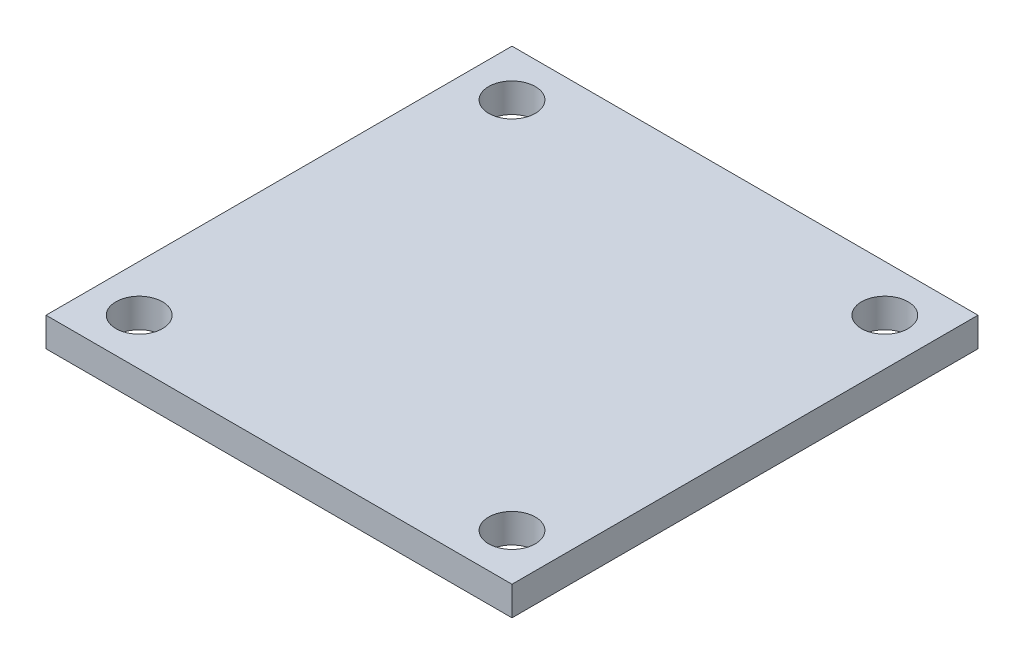
ISO-10303-21;
HEADER;
FILE_DESCRIPTION(('STEP AP214'),'2;1');
FILE_NAME('part.step','',(''),(''),'','','');
FILE_SCHEMA(('AUTOMOTIVE_DESIGN { 1 0 10303 214 1 1 1 1 }'));
ENDSEC;
DATA;
#1=APPLICATION_CONTEXT('core data for automotive mechanical design processes');
#2=APPLICATION_PROTOCOL_DEFINITION('international standard','automotive_design',2000,#1);
#3=PRODUCT_CONTEXT('',#1,'mechanical');
#4=PRODUCT('Part','Part','',(#3));
#5=PRODUCT_RELATED_PRODUCT_CATEGORY('part','',(#4));
#6=PRODUCT_DEFINITION_FORMATION('','',#4);
#7=PRODUCT_DEFINITION_CONTEXT('part definition',#1,'design');
#8=PRODUCT_DEFINITION('design','',#6,#7);
#9=PRODUCT_DEFINITION_SHAPE('','',#8);
#10=(LENGTH_UNIT() NAMED_UNIT(*) SI_UNIT(.MILLI.,.METRE.));
#11=(NAMED_UNIT(*) PLANE_ANGLE_UNIT() SI_UNIT($,.RADIAN.));
#12=(NAMED_UNIT(*) SI_UNIT($,.STERADIAN.) SOLID_ANGLE_UNIT());
#13=UNCERTAINTY_MEASURE_WITH_UNIT(LENGTH_MEASURE(1.E-05),#10,'distance_accuracy_value','');
#14=(GEOMETRIC_REPRESENTATION_CONTEXT(3) GLOBAL_UNCERTAINTY_ASSIGNED_CONTEXT((#13)) GLOBAL_UNIT_ASSIGNED_CONTEXT((#10,
#11,#12)) REPRESENTATION_CONTEXT('',''));
#15=CARTESIAN_POINT('',(0.,0.,0.));
#16=DIRECTION('',(0.,0.,1.));
#17=DIRECTION('',(1.,0.,0.));
#18=AXIS2_PLACEMENT_3D('',#15,#16,#17);
#19=CARTESIAN_POINT('',(80.,0.,80.));
#20=DIRECTION('',(0.,1.,0.));
#21=DIRECTION('',(0.,0.,1.));
#22=AXIS2_PLACEMENT_3D('',#19,#20,#21);
#23=CYLINDRICAL_SURFACE('',#22,10.);
#24=CARTESIAN_POINT('',(80.,0.,80.));
#25=DIRECTION('',(0.,1.,0.));
#26=DIRECTION('',(0.,0.,1.));
#27=AXIS2_PLACEMENT_3D('',#24,#25,#26);
#28=CIRCLE('',#27,10.);
#29=CARTESIAN_POINT('',(80.,0.,90.));
#30=VERTEX_POINT('',#29);
#31=EDGE_CURVE('E45',#30,#30,#28,.T.);
#32=ORIENTED_EDGE('',*,*,#31,.F.);
#33=EDGE_LOOP('',(#32));
#34=FACE_BOUND('',#33,.T.);
#35=CARTESIAN_POINT('',(80.,12.5,80.));
#36=DIRECTION('',(0.,1.,0.));
#37=DIRECTION('',(0.,0.,1.));
#38=AXIS2_PLACEMENT_3D('',#35,#36,#37);
#39=CIRCLE('',#38,10.);
#40=CARTESIAN_POINT('',(80.,12.5,90.));
#41=VERTEX_POINT('',#40);
#42=EDGE_CURVE('E11',#41,#41,#39,.T.);
#43=ORIENTED_EDGE('',*,*,#42,.T.);
#44=EDGE_LOOP('',(#43));
#45=FACE_BOUND('',#44,.T.);
#46=ADVANCED_FACE('F37',(#34,#45),#23,.F.);
#47=CARTESIAN_POINT('',(-80.,0.,80.));
#48=DIRECTION('',(0.,1.,0.));
#49=DIRECTION('',(0.,0.,1.));
#50=AXIS2_PLACEMENT_3D('',#47,#48,#49);
#51=CYLINDRICAL_SURFACE('',#50,10.);
#52=CARTESIAN_POINT('',(-80.,0.,80.));
#53=DIRECTION('',(0.,1.,0.));
#54=DIRECTION('',(0.,0.,1.));
#55=AXIS2_PLACEMENT_3D('',#52,#53,#54);
#56=CIRCLE('',#55,10.);
#57=CARTESIAN_POINT('',(-80.,0.,90.));
#58=VERTEX_POINT('',#57);
#59=EDGE_CURVE('E115',#58,#58,#56,.T.);
#60=ORIENTED_EDGE('',*,*,#59,.F.);
#61=EDGE_LOOP('',(#60));
#62=FACE_BOUND('',#61,.T.);
#63=CARTESIAN_POINT('',(-80.,12.5,80.));
#64=DIRECTION('',(0.,1.,0.));
#65=DIRECTION('',(0.,0.,1.));
#66=AXIS2_PLACEMENT_3D('',#63,#64,#65);
#67=CIRCLE('',#66,10.);
#68=CARTESIAN_POINT('',(-80.,12.5,90.));
#69=VERTEX_POINT('',#68);
#70=EDGE_CURVE('E118',#69,#69,#67,.T.);
#71=ORIENTED_EDGE('',*,*,#70,.T.);
#72=EDGE_LOOP('',(#71));
#73=FACE_BOUND('',#72,.T.);
#74=ADVANCED_FACE('F127',(#62,#73),#51,.F.);
#75=CARTESIAN_POINT('',(100.,12.5,-100.));
#76=DIRECTION('',(-1.,0.,0.));
#77=DIRECTION('',(0.,0.,1.));
#78=AXIS2_PLACEMENT_3D('',#75,#76,#77);
#79=PLANE('',#78);
#80=DIRECTION('',(0.,0.,-1.));
#81=VECTOR('',#80,1.);
#82=CARTESIAN_POINT('',(100.,0.,-100.));
#83=LINE('',#82,#81);
#84=CARTESIAN_POINT('',(100.,0.,100.));
#85=VERTEX_POINT('',#84);
#86=CARTESIAN_POINT('',(100.,0.,-100.));
#87=VERTEX_POINT('',#86);
#88=EDGE_CURVE('E105',#85,#87,#83,.T.);
#89=ORIENTED_EDGE('',*,*,#88,.T.);
#90=DIRECTION('',(0.,-1.,0.));
#91=VECTOR('',#90,1.);
#92=CARTESIAN_POINT('',(100.,12.5,-100.));
#93=LINE('',#92,#91);
#94=CARTESIAN_POINT('',(100.,12.5,-100.));
#95=VERTEX_POINT('',#94);
#96=EDGE_CURVE('E96',#95,#87,#93,.T.);
#97=ORIENTED_EDGE('',*,*,#96,.F.);
#98=DIRECTION('',(0.,0.,-1.));
#99=VECTOR('',#98,1.);
#100=CARTESIAN_POINT('',(100.,12.5,-100.));
#101=LINE('',#100,#99);
#102=CARTESIAN_POINT('',(100.,12.5,100.));
#103=VERTEX_POINT('',#102);
#104=EDGE_CURVE('E90',#103,#95,#101,.T.);
#105=ORIENTED_EDGE('',*,*,#104,.F.);
#106=DIRECTION('',(0.,-1.,0.));
#107=VECTOR('',#106,1.);
#108=CARTESIAN_POINT('',(100.,12.5,100.));
#109=LINE('',#108,#107);
#110=EDGE_CURVE('E101',#103,#85,#109,.T.);
#111=ORIENTED_EDGE('',*,*,#110,.T.);
#112=EDGE_LOOP('',(#89,#97,#105,#111));
#113=FACE_BOUND('',#112,.T.);
#114=ADVANCED_FACE('F151',(#113),#79,.F.);
#115=CARTESIAN_POINT('',(-100.,12.5,-100.));
#116=DIRECTION('',(0.,0.,1.));
#117=DIRECTION('',(1.,0.,0.));
#118=AXIS2_PLACEMENT_3D('',#115,#116,#117);
#119=PLANE('',#118);
#120=DIRECTION('',(-1.,0.,0.));
#121=VECTOR('',#120,1.);
#122=CARTESIAN_POINT('',(-100.,0.,-100.));
#123=LINE('',#122,#121);
#124=CARTESIAN_POINT('',(-100.,0.,-100.));
#125=VERTEX_POINT('',#124);
#126=EDGE_CURVE('E95',#87,#125,#123,.T.);
#127=ORIENTED_EDGE('',*,*,#126,.T.);
#128=DIRECTION('',(0.,-1.,0.));
#129=VECTOR('',#128,1.);
#130=CARTESIAN_POINT('',(-100.,12.5,-100.));
#131=LINE('',#130,#129);
#132=CARTESIAN_POINT('',(-100.,12.5,-100.));
#133=VERTEX_POINT('',#132);
#134=EDGE_CURVE('E93',#133,#125,#131,.T.);
#135=ORIENTED_EDGE('',*,*,#134,.F.);
#136=DIRECTION('',(-1.,0.,0.));
#137=VECTOR('',#136,1.);
#138=CARTESIAN_POINT('',(-100.,12.5,-100.));
#139=LINE('',#138,#137);
#140=EDGE_CURVE('E84',#95,#133,#139,.T.);
#141=ORIENTED_EDGE('',*,*,#140,.F.);
#142=ORIENTED_EDGE('',*,*,#96,.T.);
#143=EDGE_LOOP('',(#127,#135,#141,#142));
#144=FACE_BOUND('',#143,.T.);
#145=ADVANCED_FACE('F94',(#144),#119,.F.);
#146=CARTESIAN_POINT('',(-100.,12.5,-100.));
#147=DIRECTION('',(1.,0.,0.));
#148=DIRECTION('',(0.,0.,-1.));
#149=AXIS2_PLACEMENT_3D('',#146,#147,#148);
#150=PLANE('',#149);
#151=DIRECTION('',(0.,0.,1.));
#152=VECTOR('',#151,1.);
#153=CARTESIAN_POINT('',(-100.,0.,-100.));
#154=LINE('',#153,#152);
#155=CARTESIAN_POINT('',(-100.,0.,100.));
#156=VERTEX_POINT('',#155);
#157=EDGE_CURVE('E70',#125,#156,#154,.T.);
#158=ORIENTED_EDGE('',*,*,#157,.T.);
#159=DIRECTION('',(0.,-1.,0.));
#160=VECTOR('',#159,1.);
#161=CARTESIAN_POINT('',(-100.,12.5,100.));
#162=LINE('',#161,#160);
#163=CARTESIAN_POINT('',(-100.,12.5,100.));
#164=VERTEX_POINT('',#163);
#165=EDGE_CURVE('E97',#164,#156,#162,.T.);
#166=ORIENTED_EDGE('',*,*,#165,.F.);
#167=DIRECTION('',(0.,0.,1.));
#168=VECTOR('',#167,1.);
#169=CARTESIAN_POINT('',(-100.,12.5,-100.));
#170=LINE('',#169,#168);
#171=EDGE_CURVE('E88',#133,#164,#170,.T.);
#172=ORIENTED_EDGE('',*,*,#171,.F.);
#173=ORIENTED_EDGE('',*,*,#134,.T.);
#174=EDGE_LOOP('',(#158,#166,#172,#173));
#175=FACE_BOUND('',#174,.T.);
#176=ADVANCED_FACE('F99',(#175),#150,.F.);
#177=CARTESIAN_POINT('',(-100.,12.5,100.));
#178=DIRECTION('',(0.,0.,-1.));
#179=DIRECTION('',(-1.,0.,0.));
#180=AXIS2_PLACEMENT_3D('',#177,#178,#179);
#181=PLANE('',#180);
#182=DIRECTION('',(1.,0.,0.));
#183=VECTOR('',#182,1.);
#184=CARTESIAN_POINT('',(-100.,0.,100.));
#185=LINE('',#184,#183);
#186=EDGE_CURVE('E76',#156,#85,#185,.T.);
#187=ORIENTED_EDGE('',*,*,#186,.T.);
#188=ORIENTED_EDGE('',*,*,#110,.F.);
#189=DIRECTION('',(1.,0.,0.));
#190=VECTOR('',#189,1.);
#191=CARTESIAN_POINT('',(-100.,12.5,100.));
#192=LINE('',#191,#190);
#193=EDGE_CURVE('E53',#164,#103,#192,.T.);
#194=ORIENTED_EDGE('',*,*,#193,.F.);
#195=ORIENTED_EDGE('',*,*,#165,.T.);
#196=EDGE_LOOP('',(#187,#188,#194,#195));
#197=FACE_BOUND('',#196,.T.);
#198=ADVANCED_FACE('F131',(#197),#181,.F.);
#199=CARTESIAN_POINT('',(0.,12.5,0.));
#200=DIRECTION('',(0.,1.,0.));
#201=DIRECTION('',(0.,0.,1.));
#202=AXIS2_PLACEMENT_3D('',#199,#200,#201);
#203=PLANE('',#202);
#204=CARTESIAN_POINT('',(80.,12.5,-80.));
#205=DIRECTION('',(0.,1.,0.));
#206=DIRECTION('',(0.,0.,1.));
#207=AXIS2_PLACEMENT_3D('',#204,#205,#206);
#208=CIRCLE('',#207,10.);
#209=CARTESIAN_POINT('',(80.,12.5,-70.));
#210=VERTEX_POINT('',#209);
#211=EDGE_CURVE('E222',#210,#210,#208,.T.);
#212=ORIENTED_EDGE('',*,*,#211,.F.);
#213=EDGE_LOOP('',(#212));
#214=FACE_BOUND('',#213,.T.);
#215=CARTESIAN_POINT('',(-80.,12.5,-80.));
#216=DIRECTION('',(0.,1.,0.));
#217=DIRECTION('',(0.,0.,1.));
#218=AXIS2_PLACEMENT_3D('',#215,#216,#217);
#219=CIRCLE('',#218,10.);
#220=CARTESIAN_POINT('',(-80.,12.5,-70.));
#221=VERTEX_POINT('',#220);
#222=EDGE_CURVE('E223',#221,#221,#219,.T.);
#223=ORIENTED_EDGE('',*,*,#222,.F.);
#224=EDGE_LOOP('',(#223));
#225=FACE_BOUND('',#224,.T.);
#226=ORIENTED_EDGE('',*,*,#104,.T.);
#227=ORIENTED_EDGE('',*,*,#140,.T.);
#228=ORIENTED_EDGE('',*,*,#171,.T.);
#229=ORIENTED_EDGE('',*,*,#193,.T.);
#230=EDGE_LOOP('',(#226,#227,#228,#229));
#231=FACE_BOUND('',#230,.T.);
#232=ORIENTED_EDGE('',*,*,#70,.F.);
#233=EDGE_LOOP('',(#232));
#234=FACE_BOUND('',#233,.T.);
#235=ORIENTED_EDGE('',*,*,#42,.F.);
#236=EDGE_LOOP('',(#235));
#237=FACE_BOUND('',#236,.T.);
#238=ADVANCED_FACE('F85',(#214,#225,#231,#234,#237),#203,.T.);
#239=CARTESIAN_POINT('',(0.,0.,0.));
#240=DIRECTION('',(0.,1.,0.));
#241=DIRECTION('',(0.,0.,1.));
#242=AXIS2_PLACEMENT_3D('',#239,#240,#241);
#243=PLANE('',#242);
#244=CARTESIAN_POINT('',(80.,0.,-80.));
#245=DIRECTION('',(0.,1.,0.));
#246=DIRECTION('',(0.,0.,1.));
#247=AXIS2_PLACEMENT_3D('',#244,#245,#246);
#248=CIRCLE('',#247,10.);
#249=CARTESIAN_POINT('',(80.,0.,-70.));
#250=VERTEX_POINT('',#249);
#251=EDGE_CURVE('E220',#250,#250,#248,.T.);
#252=ORIENTED_EDGE('',*,*,#251,.T.);
#253=EDGE_LOOP('',(#252));
#254=FACE_BOUND('',#253,.T.);
#255=CARTESIAN_POINT('',(-80.,0.,-80.));
#256=DIRECTION('',(0.,1.,0.));
#257=DIRECTION('',(0.,0.,1.));
#258=AXIS2_PLACEMENT_3D('',#255,#256,#257);
#259=CIRCLE('',#258,10.);
#260=CARTESIAN_POINT('',(-80.,0.,-70.));
#261=VERTEX_POINT('',#260);
#262=EDGE_CURVE('E108',#261,#261,#259,.T.);
#263=ORIENTED_EDGE('',*,*,#262,.T.);
#264=EDGE_LOOP('',(#263));
#265=FACE_BOUND('',#264,.T.);
#266=ORIENTED_EDGE('',*,*,#88,.F.);
#267=ORIENTED_EDGE('',*,*,#186,.F.);
#268=ORIENTED_EDGE('',*,*,#157,.F.);
#269=ORIENTED_EDGE('',*,*,#126,.F.);
#270=EDGE_LOOP('',(#266,#267,#268,#269));
#271=FACE_BOUND('',#270,.T.);
#272=ORIENTED_EDGE('',*,*,#59,.T.);
#273=EDGE_LOOP('',(#272));
#274=FACE_BOUND('',#273,.T.);
#275=ORIENTED_EDGE('',*,*,#31,.T.);
#276=EDGE_LOOP('',(#275));
#277=FACE_BOUND('',#276,.T.);
#278=ADVANCED_FACE('F123',(#254,#265,#271,#274,#277),#243,.F.);
#279=CARTESIAN_POINT('',(-80.,0.,-80.));
#280=DIRECTION('',(0.,1.,0.));
#281=DIRECTION('',(0.,0.,1.));
#282=AXIS2_PLACEMENT_3D('',#279,#280,#281);
#283=CYLINDRICAL_SURFACE('',#282,10.);
#284=ORIENTED_EDGE('',*,*,#262,.F.);
#285=EDGE_LOOP('',(#284));
#286=FACE_BOUND('',#285,.T.);
#287=ORIENTED_EDGE('',*,*,#222,.T.);
#288=EDGE_LOOP('',(#287));
#289=FACE_BOUND('',#288,.T.);
#290=ADVANCED_FACE('F138',(#286,#289),#283,.F.);
#291=CARTESIAN_POINT('',(80.,0.,-80.));
#292=DIRECTION('',(0.,1.,0.));
#293=DIRECTION('',(0.,0.,1.));
#294=AXIS2_PLACEMENT_3D('',#291,#292,#293);
#295=CYLINDRICAL_SURFACE('',#294,10.);
#296=ORIENTED_EDGE('',*,*,#251,.F.);
#297=EDGE_LOOP('',(#296));
#298=FACE_BOUND('',#297,.T.);
#299=ORIENTED_EDGE('',*,*,#211,.T.);
#300=EDGE_LOOP('',(#299));
#301=FACE_BOUND('',#300,.T.);
#302=ADVANCED_FACE('F189',(#298,#301),#295,.F.);
#303=CLOSED_SHELL('',(#46,#74,#114,#145,#176,#198,#238,#278,#290,#302));
#304=MANIFOLD_SOLID_BREP('B2',#303);
#305=ADVANCED_BREP_SHAPE_REPRESENTATION('',(#18,#304),#14);
#306=SHAPE_DEFINITION_REPRESENTATION(#9,#305);
ENDSEC;
END-ISO-10303-21;
